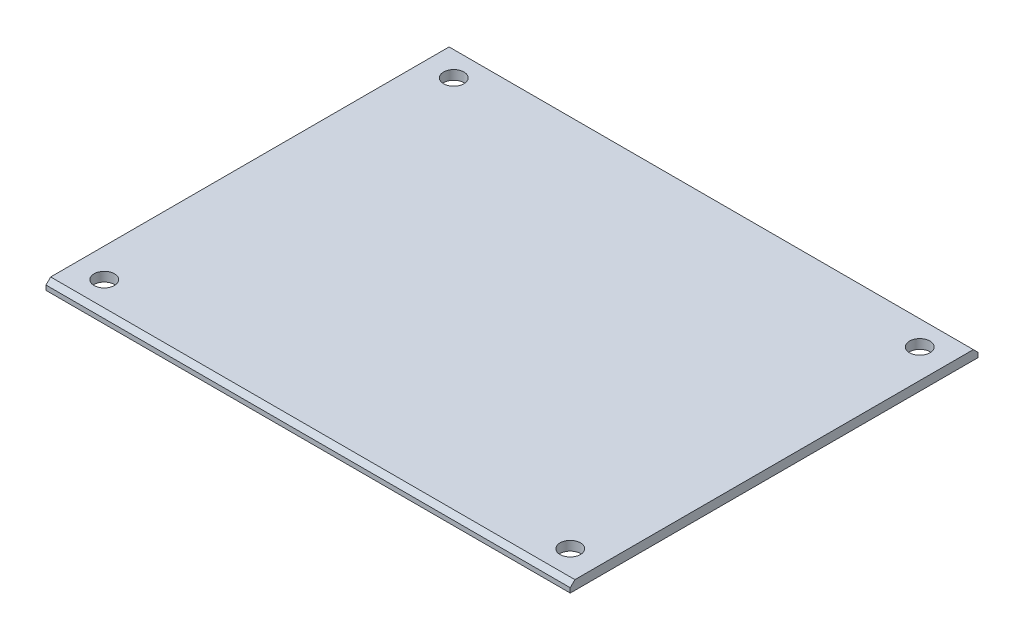
ISO-10303-21;
HEADER;
FILE_DESCRIPTION(('STEP AP214'),'2;1');
FILE_NAME('part.step','',(''),(''),'','','');
FILE_SCHEMA(('AUTOMOTIVE_DESIGN { 1 0 10303 214 1 1 1 1 }'));
ENDSEC;
DATA;
#1=APPLICATION_CONTEXT('core data for automotive mechanical design processes');
#2=APPLICATION_PROTOCOL_DEFINITION('international standard','automotive_design',2000,#1);
#3=PRODUCT_CONTEXT('',#1,'mechanical');
#4=PRODUCT('Part','Part','',(#3));
#5=PRODUCT_RELATED_PRODUCT_CATEGORY('part','',(#4));
#6=PRODUCT_DEFINITION_FORMATION('','',#4);
#7=PRODUCT_DEFINITION_CONTEXT('part definition',#1,'design');
#8=PRODUCT_DEFINITION('design','',#6,#7);
#9=PRODUCT_DEFINITION_SHAPE('','',#8);
#10=(LENGTH_UNIT() NAMED_UNIT(*) SI_UNIT(.MILLI.,.METRE.));
#11=(NAMED_UNIT(*) PLANE_ANGLE_UNIT() SI_UNIT($,.RADIAN.));
#12=(NAMED_UNIT(*) SI_UNIT($,.STERADIAN.) SOLID_ANGLE_UNIT());
#13=UNCERTAINTY_MEASURE_WITH_UNIT(LENGTH_MEASURE(1.E-05),#10,'distance_accuracy_value','');
#14=(GEOMETRIC_REPRESENTATION_CONTEXT(3) GLOBAL_UNCERTAINTY_ASSIGNED_CONTEXT((#13)) GLOBAL_UNIT_ASSIGNED_CONTEXT((#10,
#11,#12)) REPRESENTATION_CONTEXT('',''));
#15=CARTESIAN_POINT('',(0.,0.,0.));
#16=DIRECTION('',(0.,0.,1.));
#17=DIRECTION('',(1.,0.,0.));
#18=AXIS2_PLACEMENT_3D('',#15,#16,#17);
#19=CARTESIAN_POINT('',(45.,1.6,-35.));
#20=DIRECTION('',(-1.,0.,0.));
#21=DIRECTION('',(0.,0.,1.));
#22=AXIS2_PLACEMENT_3D('',#19,#20,#21);
#23=PLANE('',#22);
#24=DIRECTION('',(0.,-1.,0.));
#25=VECTOR('',#24,1.);
#26=CARTESIAN_POINT('',(45.,1.6,-35.));
#27=LINE('',#26,#25);
#28=CARTESIAN_POINT('',(45.,0.799999999999991,-35.));
#29=VERTEX_POINT('',#28);
#30=CARTESIAN_POINT('',(45.,0.,-35.));
#31=VERTEX_POINT('',#30);
#32=EDGE_CURVE('E86',#29,#31,#27,.T.);
#33=ORIENTED_EDGE('',*,*,#32,.F.);
#34=DIRECTION('',(0.,0.707106781186548,0.707106781186548));
#35=VECTOR('',#34,1.);
#36=CARTESIAN_POINT('',(45.,1.6,-34.2));
#37=LINE('',#36,#35);
#38=CARTESIAN_POINT('',(45.,1.6,-34.2));
#39=VERTEX_POINT('',#38);
#40=EDGE_CURVE('E43',#29,#39,#37,.T.);
#41=ORIENTED_EDGE('',*,*,#40,.T.);
#42=DIRECTION('',(0.,0.,-1.));
#43=VECTOR('',#42,1.);
#44=CARTESIAN_POINT('',(45.,1.6,-35.));
#45=LINE('',#44,#43);
#46=CARTESIAN_POINT('',(45.,1.6,34.2));
#47=VERTEX_POINT('',#46);
#48=EDGE_CURVE('E118',#47,#39,#45,.T.);
#49=ORIENTED_EDGE('',*,*,#48,.F.);
#50=DIRECTION('',(0.,-0.707106781186548,0.707106781186548));
#51=VECTOR('',#50,1.);
#52=CARTESIAN_POINT('',(45.,1.6,34.2));
#53=LINE('',#52,#51);
#54=CARTESIAN_POINT('',(45.,0.799999999999991,35.));
#55=VERTEX_POINT('',#54);
#56=EDGE_CURVE('E50',#47,#55,#53,.T.);
#57=ORIENTED_EDGE('',*,*,#56,.T.);
#58=DIRECTION('',(0.,-1.,0.));
#59=VECTOR('',#58,1.);
#60=CARTESIAN_POINT('',(45.,1.6,35.));
#61=LINE('',#60,#59);
#62=CARTESIAN_POINT('',(45.,0.,35.));
#63=VERTEX_POINT('',#62);
#64=EDGE_CURVE('E104',#55,#63,#61,.T.);
#65=ORIENTED_EDGE('',*,*,#64,.T.);
#66=DIRECTION('',(0.,0.,-1.));
#67=VECTOR('',#66,1.);
#68=CARTESIAN_POINT('',(45.,0.,-35.));
#69=LINE('',#68,#67);
#70=EDGE_CURVE('E100',#63,#31,#69,.T.);
#71=ORIENTED_EDGE('',*,*,#70,.T.);
#72=EDGE_LOOP('',(#33,#41,#49,#57,#65,#71));
#73=FACE_BOUND('',#72,.T.);
#74=ADVANCED_FACE('F35',(#73),#23,.F.);
#75=CARTESIAN_POINT('',(-45.,1.6,-35.));
#76=DIRECTION('',(0.,0.,1.));
#77=DIRECTION('',(1.,0.,0.));
#78=AXIS2_PLACEMENT_3D('',#75,#76,#77);
#79=PLANE('',#78);
#80=DIRECTION('',(0.,-1.,0.));
#81=VECTOR('',#80,1.);
#82=CARTESIAN_POINT('',(-45.,1.6,-35.));
#83=LINE('',#82,#81);
#84=CARTESIAN_POINT('',(-45.,0.799999999999991,-35.));
#85=VERTEX_POINT('',#84);
#86=CARTESIAN_POINT('',(-45.,0.,-35.));
#87=VERTEX_POINT('',#86);
#88=EDGE_CURVE('E94',#85,#87,#83,.T.);
#89=ORIENTED_EDGE('',*,*,#88,.F.);
#90=DIRECTION('',(1.,0.,0.));
#91=VECTOR('',#90,1.);
#92=CARTESIAN_POINT('',(45.,0.799999999999991,-35.));
#93=LINE('',#92,#91);
#94=EDGE_CURVE('E58',#85,#29,#93,.T.);
#95=ORIENTED_EDGE('',*,*,#94,.T.);
#96=ORIENTED_EDGE('',*,*,#32,.T.);
#97=DIRECTION('',(-1.,0.,0.));
#98=VECTOR('',#97,1.);
#99=CARTESIAN_POINT('',(-45.,0.,-35.));
#100=LINE('',#99,#98);
#101=EDGE_CURVE('E89',#31,#87,#100,.T.);
#102=ORIENTED_EDGE('',*,*,#101,.T.);
#103=EDGE_LOOP('',(#89,#95,#96,#102));
#104=FACE_BOUND('',#103,.T.);
#105=ADVANCED_FACE('F88',(#104),#79,.F.);
#106=CARTESIAN_POINT('',(-45.,1.6,-35.));
#107=DIRECTION('',(1.,0.,0.));
#108=DIRECTION('',(0.,0.,-1.));
#109=AXIS2_PLACEMENT_3D('',#106,#107,#108);
#110=PLANE('',#109);
#111=DIRECTION('',(0.,0.,1.));
#112=VECTOR('',#111,1.);
#113=CARTESIAN_POINT('',(-45.,1.6,-35.));
#114=LINE('',#113,#112);
#115=CARTESIAN_POINT('',(-45.,1.6,-34.2));
#116=VERTEX_POINT('',#115);
#117=CARTESIAN_POINT('',(-45.,1.6,34.2));
#118=VERTEX_POINT('',#117);
#119=EDGE_CURVE('E112',#116,#118,#114,.T.);
#120=ORIENTED_EDGE('',*,*,#119,.F.);
#121=DIRECTION('',(0.,-0.707106781186548,-0.707106781186548));
#122=VECTOR('',#121,1.);
#123=CARTESIAN_POINT('',(-45.,1.6,-34.2));
#124=LINE('',#123,#122);
#125=EDGE_CURVE('E130',#116,#85,#124,.T.);
#126=ORIENTED_EDGE('',*,*,#125,.T.);
#127=ORIENTED_EDGE('',*,*,#88,.T.);
#128=DIRECTION('',(0.,0.,1.));
#129=VECTOR('',#128,1.);
#130=CARTESIAN_POINT('',(-45.,0.,-35.));
#131=LINE('',#130,#129);
#132=CARTESIAN_POINT('',(-45.,0.,35.));
#133=VERTEX_POINT('',#132);
#134=EDGE_CURVE('E102',#87,#133,#131,.T.);
#135=ORIENTED_EDGE('',*,*,#134,.T.);
#136=DIRECTION('',(0.,-1.,0.));
#137=VECTOR('',#136,1.);
#138=CARTESIAN_POINT('',(-45.,1.6,35.));
#139=LINE('',#138,#137);
#140=CARTESIAN_POINT('',(-45.,0.799999999999991,35.));
#141=VERTEX_POINT('',#140);
#142=EDGE_CURVE('E120',#141,#133,#139,.T.);
#143=ORIENTED_EDGE('',*,*,#142,.F.);
#144=DIRECTION('',(0.,0.707106781186548,-0.707106781186548));
#145=VECTOR('',#144,1.);
#146=CARTESIAN_POINT('',(-45.,1.6,34.2));
#147=LINE('',#146,#145);
#148=EDGE_CURVE('E128',#141,#118,#147,.T.);
#149=ORIENTED_EDGE('',*,*,#148,.T.);
#150=EDGE_LOOP('',(#120,#126,#127,#135,#143,#149));
#151=FACE_BOUND('',#150,.T.);
#152=ADVANCED_FACE('F143',(#151),#110,.F.);
#153=CARTESIAN_POINT('',(-45.,1.6,35.));
#154=DIRECTION('',(0.,0.,-1.));
#155=DIRECTION('',(-1.,0.,0.));
#156=AXIS2_PLACEMENT_3D('',#153,#154,#155);
#157=PLANE('',#156);
#158=ORIENTED_EDGE('',*,*,#64,.F.);
#159=DIRECTION('',(-1.,0.,0.));
#160=VECTOR('',#159,1.);
#161=CARTESIAN_POINT('',(-45.,0.799999999999991,35.));
#162=LINE('',#161,#160);
#163=EDGE_CURVE('E11',#55,#141,#162,.T.);
#164=ORIENTED_EDGE('',*,*,#163,.T.);
#165=ORIENTED_EDGE('',*,*,#142,.T.);
#166=DIRECTION('',(1.,0.,0.));
#167=VECTOR('',#166,1.);
#168=CARTESIAN_POINT('',(-45.,0.,35.));
#169=LINE('',#168,#167);
#170=EDGE_CURVE('E116',#133,#63,#169,.T.);
#171=ORIENTED_EDGE('',*,*,#170,.T.);
#172=EDGE_LOOP('',(#158,#164,#165,#171));
#173=FACE_BOUND('',#172,.T.);
#174=ADVANCED_FACE('F149',(#173),#157,.F.);
#175=CARTESIAN_POINT('',(0.,1.6,0.));
#176=DIRECTION('',(0.,1.,0.));
#177=DIRECTION('',(0.,0.,1.));
#178=AXIS2_PLACEMENT_3D('',#175,#176,#177);
#179=PLANE('',#178);
#180=CARTESIAN_POINT('',(40.,1.6,30.));
#181=DIRECTION('',(0.,1.,0.));
#182=DIRECTION('',(0.,0.,1.));
#183=AXIS2_PLACEMENT_3D('',#180,#181,#182);
#184=CIRCLE('',#183,1.75);
#185=CARTESIAN_POINT('',(40.,1.6,31.75));
#186=VERTEX_POINT('',#185);
#187=EDGE_CURVE('E212',#186,#186,#184,.T.);
#188=ORIENTED_EDGE('',*,*,#187,.F.);
#189=EDGE_LOOP('',(#188));
#190=FACE_BOUND('',#189,.T.);
#191=CARTESIAN_POINT('',(40.,1.6,-30.));
#192=DIRECTION('',(0.,1.,0.));
#193=DIRECTION('',(0.,0.,1.));
#194=AXIS2_PLACEMENT_3D('',#191,#192,#193);
#195=CIRCLE('',#194,1.75);
#196=CARTESIAN_POINT('',(40.,1.6,-28.25));
#197=VERTEX_POINT('',#196);
#198=EDGE_CURVE('E216',#197,#197,#195,.T.);
#199=ORIENTED_EDGE('',*,*,#198,.F.);
#200=EDGE_LOOP('',(#199));
#201=FACE_BOUND('',#200,.T.);
#202=CARTESIAN_POINT('',(-40.,1.6,-30.));
#203=DIRECTION('',(0.,1.,0.));
#204=DIRECTION('',(0.,0.,1.));
#205=AXIS2_PLACEMENT_3D('',#202,#203,#204);
#206=CIRCLE('',#205,1.75);
#207=CARTESIAN_POINT('',(-40.,1.6,-28.25));
#208=VERTEX_POINT('',#207);
#209=EDGE_CURVE('E209',#208,#208,#206,.T.);
#210=ORIENTED_EDGE('',*,*,#209,.F.);
#211=EDGE_LOOP('',(#210));
#212=FACE_BOUND('',#211,.T.);
#213=CARTESIAN_POINT('',(-40.,1.6,30.));
#214=DIRECTION('',(0.,1.,0.));
#215=DIRECTION('',(0.,0.,1.));
#216=AXIS2_PLACEMENT_3D('',#213,#214,#215);
#217=CIRCLE('',#216,1.75);
#218=CARTESIAN_POINT('',(-40.,1.6,31.75));
#219=VERTEX_POINT('',#218);
#220=EDGE_CURVE('E109',#219,#219,#217,.T.);
#221=ORIENTED_EDGE('',*,*,#220,.F.);
#222=EDGE_LOOP('',(#221));
#223=FACE_BOUND('',#222,.T.);
#224=ORIENTED_EDGE('',*,*,#48,.T.);
#225=DIRECTION('',(-1.,0.,0.));
#226=VECTOR('',#225,1.);
#227=CARTESIAN_POINT('',(-45.,1.6,-34.2));
#228=LINE('',#227,#226);
#229=EDGE_CURVE('E125',#39,#116,#228,.T.);
#230=ORIENTED_EDGE('',*,*,#229,.T.);
#231=ORIENTED_EDGE('',*,*,#119,.T.);
#232=DIRECTION('',(1.,0.,0.));
#233=VECTOR('',#232,1.);
#234=CARTESIAN_POINT('',(45.,1.6,34.2));
#235=LINE('',#234,#233);
#236=EDGE_CURVE('E93',#118,#47,#235,.T.);
#237=ORIENTED_EDGE('',*,*,#236,.T.);
#238=EDGE_LOOP('',(#224,#230,#231,#237));
#239=FACE_BOUND('',#238,.T.);
#240=ADVANCED_FACE('F137',(#190,#201,#212,#223,#239),#179,.T.);
#241=CARTESIAN_POINT('',(0.,0.,0.));
#242=DIRECTION('',(0.,1.,0.));
#243=DIRECTION('',(0.,0.,1.));
#244=AXIS2_PLACEMENT_3D('',#241,#242,#243);
#245=PLANE('',#244);
#246=CARTESIAN_POINT('',(40.,0.,30.));
#247=DIRECTION('',(0.,1.,0.));
#248=DIRECTION('',(0.,0.,1.));
#249=AXIS2_PLACEMENT_3D('',#246,#247,#248);
#250=CIRCLE('',#249,1.75);
#251=CARTESIAN_POINT('',(40.,0.,31.75));
#252=VERTEX_POINT('',#251);
#253=EDGE_CURVE('E194',#252,#252,#250,.T.);
#254=ORIENTED_EDGE('',*,*,#253,.T.);
#255=EDGE_LOOP('',(#254));
#256=FACE_BOUND('',#255,.T.);
#257=CARTESIAN_POINT('',(40.,0.,-30.));
#258=DIRECTION('',(0.,1.,0.));
#259=DIRECTION('',(0.,0.,1.));
#260=AXIS2_PLACEMENT_3D('',#257,#258,#259);
#261=CIRCLE('',#260,1.75);
#262=CARTESIAN_POINT('',(40.,0.,-28.25));
#263=VERTEX_POINT('',#262);
#264=EDGE_CURVE('E198',#263,#263,#261,.T.);
#265=ORIENTED_EDGE('',*,*,#264,.T.);
#266=EDGE_LOOP('',(#265));
#267=FACE_BOUND('',#266,.T.);
#268=CARTESIAN_POINT('',(-40.,0.,-30.));
#269=DIRECTION('',(0.,1.,0.));
#270=DIRECTION('',(0.,0.,1.));
#271=AXIS2_PLACEMENT_3D('',#268,#269,#270);
#272=CIRCLE('',#271,1.75);
#273=CARTESIAN_POINT('',(-40.,0.,-28.25));
#274=VERTEX_POINT('',#273);
#275=EDGE_CURVE('E202',#274,#274,#272,.T.);
#276=ORIENTED_EDGE('',*,*,#275,.T.);
#277=EDGE_LOOP('',(#276));
#278=FACE_BOUND('',#277,.T.);
#279=CARTESIAN_POINT('',(-40.,0.,30.));
#280=DIRECTION('',(0.,1.,0.));
#281=DIRECTION('',(0.,0.,1.));
#282=AXIS2_PLACEMENT_3D('',#279,#280,#281);
#283=CIRCLE('',#282,1.75);
#284=CARTESIAN_POINT('',(-40.,0.,31.75));
#285=VERTEX_POINT('',#284);
#286=EDGE_CURVE('E106',#285,#285,#283,.T.);
#287=ORIENTED_EDGE('',*,*,#286,.T.);
#288=EDGE_LOOP('',(#287));
#289=FACE_BOUND('',#288,.T.);
#290=ORIENTED_EDGE('',*,*,#70,.F.);
#291=ORIENTED_EDGE('',*,*,#170,.F.);
#292=ORIENTED_EDGE('',*,*,#134,.F.);
#293=ORIENTED_EDGE('',*,*,#101,.F.);
#294=EDGE_LOOP('',(#290,#291,#292,#293));
#295=FACE_BOUND('',#294,.T.);
#296=ADVANCED_FACE('F98',(#256,#267,#278,#289,#295),#245,.F.);
#297=CARTESIAN_POINT('',(-40.,0.,30.));
#298=DIRECTION('',(0.,1.,0.));
#299=DIRECTION('',(0.,0.,1.));
#300=AXIS2_PLACEMENT_3D('',#297,#298,#299);
#301=CYLINDRICAL_SURFACE('',#300,1.75);
#302=ORIENTED_EDGE('',*,*,#286,.F.);
#303=EDGE_LOOP('',(#302));
#304=FACE_BOUND('',#303,.T.);
#305=ORIENTED_EDGE('',*,*,#220,.T.);
#306=EDGE_LOOP('',(#305));
#307=FACE_BOUND('',#306,.T.);
#308=ADVANCED_FACE('F185',(#304,#307),#301,.F.);
#309=CARTESIAN_POINT('',(-40.,0.,-30.));
#310=DIRECTION('',(0.,1.,0.));
#311=DIRECTION('',(0.,0.,1.));
#312=AXIS2_PLACEMENT_3D('',#309,#310,#311);
#313=CYLINDRICAL_SURFACE('',#312,1.75);
#314=ORIENTED_EDGE('',*,*,#275,.F.);
#315=EDGE_LOOP('',(#314));
#316=FACE_BOUND('',#315,.T.);
#317=ORIENTED_EDGE('',*,*,#209,.T.);
#318=EDGE_LOOP('',(#317));
#319=FACE_BOUND('',#318,.T.);
#320=ADVANCED_FACE('F178',(#316,#319),#313,.F.);
#321=CARTESIAN_POINT('',(40.,0.,-30.));
#322=DIRECTION('',(0.,1.,0.));
#323=DIRECTION('',(0.,0.,1.));
#324=AXIS2_PLACEMENT_3D('',#321,#322,#323);
#325=CYLINDRICAL_SURFACE('',#324,1.75);
#326=ORIENTED_EDGE('',*,*,#264,.F.);
#327=EDGE_LOOP('',(#326));
#328=FACE_BOUND('',#327,.T.);
#329=ORIENTED_EDGE('',*,*,#198,.T.);
#330=EDGE_LOOP('',(#329));
#331=FACE_BOUND('',#330,.T.);
#332=ADVANCED_FACE('F172',(#328,#331),#325,.F.);
#333=CARTESIAN_POINT('',(40.,0.,30.));
#334=DIRECTION('',(0.,1.,0.));
#335=DIRECTION('',(0.,0.,1.));
#336=AXIS2_PLACEMENT_3D('',#333,#334,#335);
#337=CYLINDRICAL_SURFACE('',#336,1.75);
#338=ORIENTED_EDGE('',*,*,#253,.F.);
#339=EDGE_LOOP('',(#338));
#340=FACE_BOUND('',#339,.T.);
#341=ORIENTED_EDGE('',*,*,#187,.T.);
#342=EDGE_LOOP('',(#341));
#343=FACE_BOUND('',#342,.T.);
#344=ADVANCED_FACE('F167',(#340,#343),#337,.F.);
#345=CARTESIAN_POINT('',(0.,1.6,-34.2));
#346=DIRECTION('',(0.,0.707106781186547,-0.707106781186547));
#347=DIRECTION('',(1.,0.,0.));
#348=AXIS2_PLACEMENT_3D('',#345,#346,#347);
#349=PLANE('',#348);
#350=ORIENTED_EDGE('',*,*,#40,.F.);
#351=ORIENTED_EDGE('',*,*,#94,.F.);
#352=ORIENTED_EDGE('',*,*,#125,.F.);
#353=ORIENTED_EDGE('',*,*,#229,.F.);
#354=EDGE_LOOP('',(#350,#351,#352,#353));
#355=FACE_BOUND('',#354,.T.);
#356=ADVANCED_FACE('F141',(#355),#349,.T.);
#357=CARTESIAN_POINT('',(0.,1.6,34.2));
#358=DIRECTION('',(0.,0.707106781186547,0.707106781186547));
#359=DIRECTION('',(-1.,0.,0.));
#360=AXIS2_PLACEMENT_3D('',#357,#358,#359);
#361=PLANE('',#360);
#362=ORIENTED_EDGE('',*,*,#148,.F.);
#363=ORIENTED_EDGE('',*,*,#163,.F.);
#364=ORIENTED_EDGE('',*,*,#56,.F.);
#365=ORIENTED_EDGE('',*,*,#236,.F.);
#366=EDGE_LOOP('',(#362,#363,#364,#365));
#367=FACE_BOUND('',#366,.T.);
#368=ADVANCED_FACE('F37',(#367),#361,.T.);
#369=CLOSED_SHELL('',(#74,#105,#152,#174,#240,#296,#308,#320,#332,#344,#356,#368));
#370=MANIFOLD_SOLID_BREP('B2',#369);
#371=ADVANCED_BREP_SHAPE_REPRESENTATION('',(#18,#370),#14);
#372=SHAPE_DEFINITION_REPRESENTATION(#9,#371);
ENDSEC;
END-ISO-10303-21;
